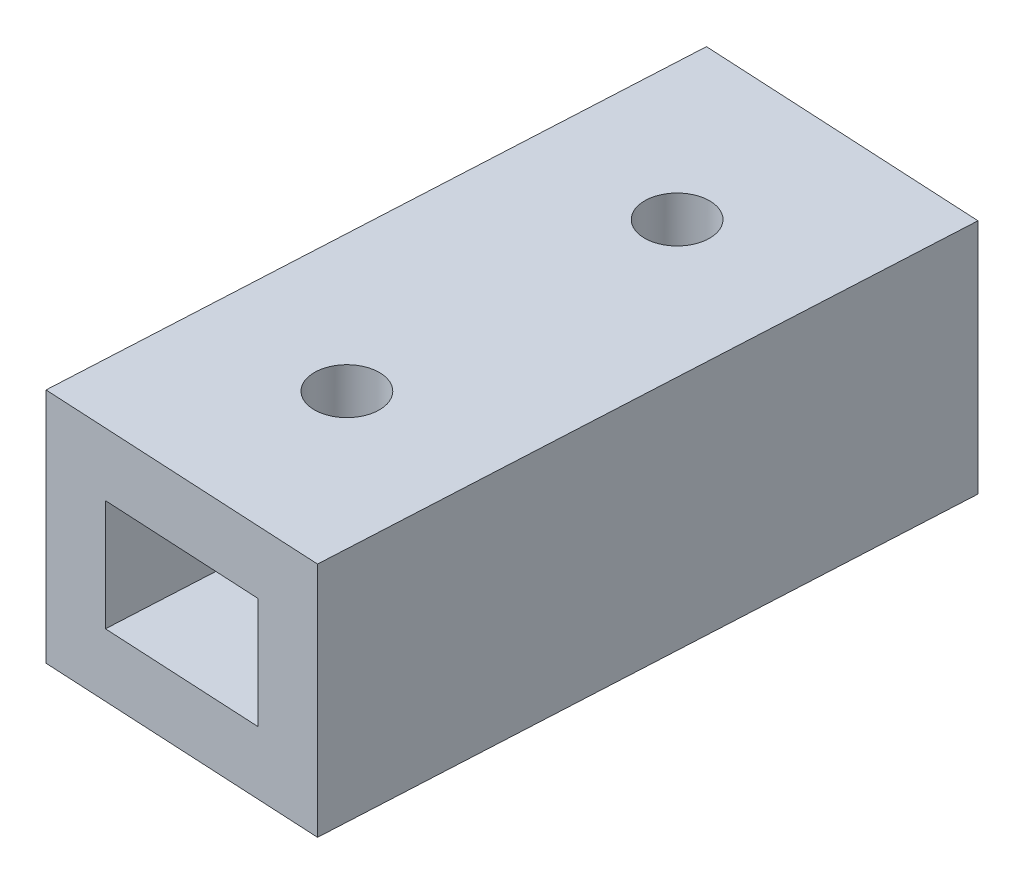
ISO-10303-21;
HEADER;
FILE_DESCRIPTION(('STEP AP214'),'2;1');
FILE_NAME('part.step','',(''),(''),'','','');
FILE_SCHEMA(('AUTOMOTIVE_DESIGN { 1 0 10303 214 1 1 1 1 }'));
ENDSEC;
DATA;
#1=APPLICATION_CONTEXT('core data for automotive mechanical design processes');
#2=APPLICATION_PROTOCOL_DEFINITION('international standard','automotive_design',2000,#1);
#3=PRODUCT_CONTEXT('',#1,'mechanical');
#4=PRODUCT('Part','Part','',(#3));
#5=PRODUCT_RELATED_PRODUCT_CATEGORY('part','',(#4));
#6=PRODUCT_DEFINITION_FORMATION('','',#4);
#7=PRODUCT_DEFINITION_CONTEXT('part definition',#1,'design');
#8=PRODUCT_DEFINITION('design','',#6,#7);
#9=PRODUCT_DEFINITION_SHAPE('','',#8);
#10=(LENGTH_UNIT() NAMED_UNIT(*) SI_UNIT(.MILLI.,.METRE.));
#11=(NAMED_UNIT(*) PLANE_ANGLE_UNIT() SI_UNIT($,.RADIAN.));
#12=(NAMED_UNIT(*) SI_UNIT($,.STERADIAN.) SOLID_ANGLE_UNIT());
#13=UNCERTAINTY_MEASURE_WITH_UNIT(LENGTH_MEASURE(1.E-05),#10,'distance_accuracy_value','');
#14=(GEOMETRIC_REPRESENTATION_CONTEXT(3) GLOBAL_UNCERTAINTY_ASSIGNED_CONTEXT((#13)) GLOBAL_UNIT_ASSIGNED_CONTEXT((#10,
#11,#12)) REPRESENTATION_CONTEXT('',''));
#15=CARTESIAN_POINT('',(0.,0.,0.));
#16=DIRECTION('',(0.,0.,1.));
#17=DIRECTION('',(1.,0.,0.));
#18=AXIS2_PLACEMENT_3D('',#15,#16,#17);
#19=CARTESIAN_POINT('',(-10.6064053641443,0.,202.091887035301));
#20=DIRECTION('',(0.052410950747902,0.,-0.998625601635418));
#21=DIRECTION('',(-0.998625601635418,0.,-0.052410950747902));
#22=AXIS2_PLACEMENT_3D('',#19,#20,#21);
#23=PLANE('',#22);
#24=DIRECTION('',(-0.998625601635418,0.,-0.052410950747902));
#25=VECTOR('',#24,1.);
#26=CARTESIAN_POINT('',(-15.353434046431,5.65,201.84274833301));
#27=LINE('',#26,#25);
#28=CARTESIAN_POINT('',(-1.67226330402577,5.65,202.560778358256));
#29=VERTEX_POINT('',#28);
#30=CARTESIAN_POINT('',(-15.353434046431,5.65,201.84274833301));
#31=VERTEX_POINT('',#30);
#32=EDGE_CURVE('E138',#29,#31,#27,.T.);
#33=ORIENTED_EDGE('',*,*,#32,.T.);
#34=DIRECTION('',(0.,-1.,0.));
#35=VECTOR('',#34,1.);
#36=CARTESIAN_POINT('',(-15.353434046431,5.65,201.84274833301));
#37=LINE('',#36,#35);
#38=CARTESIAN_POINT('',(-15.353434046431,-5.65,201.84274833301));
#39=VERTEX_POINT('',#38);
#40=EDGE_CURVE('E141',#31,#39,#37,.T.);
#41=ORIENTED_EDGE('',*,*,#40,.T.);
#42=DIRECTION('',(0.998625601635418,0.,0.052410950747902));
#43=VECTOR('',#42,1.);
#44=CARTESIAN_POINT('',(-15.353434046431,-5.65,201.84274833301));
#45=LINE('',#44,#43);
#46=CARTESIAN_POINT('',(-1.67226330402577,-5.65,202.560778358256));
#47=VERTEX_POINT('',#46);
#48=EDGE_CURVE('E144',#39,#47,#45,.T.);
#49=ORIENTED_EDGE('',*,*,#48,.T.);
#50=DIRECTION('',(0.,1.,0.));
#51=VECTOR('',#50,1.);
#52=CARTESIAN_POINT('',(-1.67226330402577,5.65,202.560778358256));
#53=LINE('',#52,#51);
#54=EDGE_CURVE('E146',#47,#29,#53,.T.);
#55=ORIENTED_EDGE('',*,*,#54,.T.);
#56=EDGE_LOOP('',(#33,#41,#49,#55));
#57=FACE_BOUND('',#56,.T.);
#58=DIRECTION('',(-0.998625601635418,0.,-0.0524109507479038));
#59=VECTOR('',#58,1.);
#60=CARTESIAN_POINT('',(-12.3575572415248,2.65,201.999981185253));
#61=LINE('',#60,#59);
#62=CARTESIAN_POINT('',(-4.66814010893203,2.65,202.403545506012));
#63=VERTEX_POINT('',#62);
#64=CARTESIAN_POINT('',(-12.3575572415248,2.65,201.999981185253));
#65=VERTEX_POINT('',#64);
#66=EDGE_CURVE('E100',#63,#65,#61,.T.);
#67=ORIENTED_EDGE('',*,*,#66,.F.);
#68=DIRECTION('',(0.,1.,0.));
#69=VECTOR('',#68,1.);
#70=CARTESIAN_POINT('',(-4.66814010893203,2.65,202.403545506012));
#71=LINE('',#70,#69);
#72=CARTESIAN_POINT('',(-4.66814010893203,-2.65,202.403545506012));
#73=VERTEX_POINT('',#72);
#74=EDGE_CURVE('E122',#73,#63,#71,.T.);
#75=ORIENTED_EDGE('',*,*,#74,.F.);
#76=DIRECTION('',(0.998625601635418,0.,0.0524109507479037));
#77=VECTOR('',#76,1.);
#78=CARTESIAN_POINT('',(-12.3575572415248,-2.65,201.999981185253));
#79=LINE('',#78,#77);
#80=CARTESIAN_POINT('',(-12.3575572415248,-2.65,201.999981185253));
#81=VERTEX_POINT('',#80);
#82=EDGE_CURVE('E120',#81,#73,#79,.T.);
#83=ORIENTED_EDGE('',*,*,#82,.F.);
#84=DIRECTION('',(0.,-1.,0.));
#85=VECTOR('',#84,1.);
#86=CARTESIAN_POINT('',(-12.3575572415248,2.65,201.999981185253));
#87=LINE('',#86,#85);
#88=EDGE_CURVE('E108',#65,#81,#87,.T.);
#89=ORIENTED_EDGE('',*,*,#88,.F.);
#90=EDGE_LOOP('',(#67,#75,#83,#89));
#91=FACE_BOUND('',#90,.T.);
#92=ADVANCED_FACE('F33',(#57,#91),#23,.F.);
#93=CARTESIAN_POINT('',(-9.03407684170723,0.,172.133118986238));
#94=DIRECTION('',(0.052410950747902,0.,-0.998625601635418));
#95=DIRECTION('',(-0.998625601635418,0.,-0.052410950747902));
#96=AXIS2_PLACEMENT_3D('',#93,#94,#95);
#97=PLANE('',#96);
#98=DIRECTION('',(-0.998625601635418,0.,-0.052410950747902));
#99=VECTOR('',#98,1.);
#100=CARTESIAN_POINT('',(-13.7811055239939,5.65,171.883980283947));
#101=LINE('',#100,#99);
#102=CARTESIAN_POINT('',(-0.0999347815886781,5.65,172.602010309193));
#103=VERTEX_POINT('',#102);
#104=CARTESIAN_POINT('',(-13.7811055239939,5.65,171.883980283947));
#105=VERTEX_POINT('',#104);
#106=EDGE_CURVE('E116',#103,#105,#101,.T.);
#107=ORIENTED_EDGE('',*,*,#106,.F.);
#108=DIRECTION('',(0.,1.,0.));
#109=VECTOR('',#108,1.);
#110=CARTESIAN_POINT('',(-0.0999347815886781,5.65,172.602010309193));
#111=LINE('',#110,#109);
#112=CARTESIAN_POINT('',(-0.0999347815886764,-5.65,172.602010309193));
#113=VERTEX_POINT('',#112);
#114=EDGE_CURVE('E142',#113,#103,#111,.T.);
#115=ORIENTED_EDGE('',*,*,#114,.F.);
#116=DIRECTION('',(0.998625601635418,0.,0.052410950747902));
#117=VECTOR('',#116,1.);
#118=CARTESIAN_POINT('',(-13.7811055239939,-5.65,171.883980283947));
#119=LINE('',#118,#117);
#120=CARTESIAN_POINT('',(-13.7811055239939,-5.65,171.883980283947));
#121=VERTEX_POINT('',#120);
#122=EDGE_CURVE('E153',#121,#113,#119,.T.);
#123=ORIENTED_EDGE('',*,*,#122,.F.);
#124=DIRECTION('',(0.,-1.,0.));
#125=VECTOR('',#124,1.);
#126=CARTESIAN_POINT('',(-13.7811055239939,5.65,171.883980283947));
#127=LINE('',#126,#125);
#128=EDGE_CURVE('E151',#105,#121,#127,.T.);
#129=ORIENTED_EDGE('',*,*,#128,.F.);
#130=EDGE_LOOP('',(#107,#115,#123,#129));
#131=FACE_BOUND('',#130,.T.);
#132=DIRECTION('',(0.,1.,0.));
#133=VECTOR('',#132,1.);
#134=CARTESIAN_POINT('',(-3.09581158649493,2.65,172.44477745695));
#135=LINE('',#134,#133);
#136=CARTESIAN_POINT('',(-3.09581158649493,-2.65,172.44477745695));
#137=VERTEX_POINT('',#136);
#138=CARTESIAN_POINT('',(-3.09581158649493,2.65,172.44477745695));
#139=VERTEX_POINT('',#138);
#140=EDGE_CURVE('E109',#137,#139,#135,.T.);
#141=ORIENTED_EDGE('',*,*,#140,.T.);
#142=DIRECTION('',(-0.998625601635418,0.,-0.0524109507479038));
#143=VECTOR('',#142,1.);
#144=CARTESIAN_POINT('',(-10.7852287190877,2.65,172.041213136191));
#145=LINE('',#144,#143);
#146=CARTESIAN_POINT('',(-10.7852287190877,2.65,172.041213136191));
#147=VERTEX_POINT('',#146);
#148=EDGE_CURVE('E58',#139,#147,#145,.T.);
#149=ORIENTED_EDGE('',*,*,#148,.T.);
#150=DIRECTION('',(0.,-1.,0.));
#151=VECTOR('',#150,1.);
#152=CARTESIAN_POINT('',(-10.7852287190877,2.65,172.041213136191));
#153=LINE('',#152,#151);
#154=CARTESIAN_POINT('',(-10.7852287190877,-2.65,172.041213136191));
#155=VERTEX_POINT('',#154);
#156=EDGE_CURVE('E115',#147,#155,#153,.T.);
#157=ORIENTED_EDGE('',*,*,#156,.T.);
#158=DIRECTION('',(0.998625601635418,0.,0.0524109507479037));
#159=VECTOR('',#158,1.);
#160=CARTESIAN_POINT('',(-10.7852287190877,-2.65,172.041213136191));
#161=LINE('',#160,#159);
#162=EDGE_CURVE('E130',#155,#137,#161,.T.);
#163=ORIENTED_EDGE('',*,*,#162,.T.);
#164=EDGE_LOOP('',(#141,#149,#157,#163));
#165=FACE_BOUND('',#164,.T.);
#166=ADVANCED_FACE('F207',(#131,#165),#97,.T.);
#167=CARTESIAN_POINT('',(-15.353434046431,5.65,201.84274833301));
#168=DIRECTION('',(0.,-1.,0.));
#169=DIRECTION('',(0.,0.,-1.));
#170=AXIS2_PLACEMENT_3D('',#167,#168,#169);
#171=PLANE('',#170);
#172=CARTESIAN_POINT('',(-7.33360228340059,5.65,179.732687308836));
#173=DIRECTION('',(0.,1.,0.));
#174=DIRECTION('',(0.,0.,1.));
#175=AXIS2_PLACEMENT_3D('',#172,#173,#174);
#176=CIRCLE('',#175,1.55);
#177=CARTESIAN_POINT('',(-7.33360228340059,5.65,181.282687308836));
#178=VERTEX_POINT('',#177);
#179=EDGE_CURVE('E165',#178,#178,#176,.T.);
#180=ORIENTED_EDGE('',*,*,#179,.F.);
#181=EDGE_LOOP('',(#180));
#182=FACE_BOUND('',#181,.T.);
#183=CARTESIAN_POINT('',(-8.11976654461914,5.65,194.712071333367));
#184=DIRECTION('',(0.,1.,0.));
#185=DIRECTION('',(0.,0.,1.));
#186=AXIS2_PLACEMENT_3D('',#183,#184,#185);
#187=CIRCLE('',#186,1.55);
#188=CARTESIAN_POINT('',(-8.11976654461914,5.65,196.262071333367));
#189=VERTEX_POINT('',#188);
#190=EDGE_CURVE('E172',#189,#189,#187,.T.);
#191=ORIENTED_EDGE('',*,*,#190,.F.);
#192=EDGE_LOOP('',(#191));
#193=FACE_BOUND('',#192,.T.);
#194=ORIENTED_EDGE('',*,*,#106,.T.);
#195=DIRECTION('',(0.0524109507479032,0.,-0.998625601635418));
#196=VECTOR('',#195,1.);
#197=CARTESIAN_POINT('',(-15.353434046431,5.65,201.84274833301));
#198=LINE('',#197,#196);
#199=EDGE_CURVE('E11',#31,#105,#198,.T.);
#200=ORIENTED_EDGE('',*,*,#199,.F.);
#201=ORIENTED_EDGE('',*,*,#32,.F.);
#202=DIRECTION('',(0.0524109507479032,0.,-0.998625601635418));
#203=VECTOR('',#202,1.);
#204=CARTESIAN_POINT('',(-1.67226330402577,5.65,202.560778358256));
#205=LINE('',#204,#203);
#206=EDGE_CURVE('E148',#29,#103,#205,.T.);
#207=ORIENTED_EDGE('',*,*,#206,.T.);
#208=EDGE_LOOP('',(#194,#200,#201,#207));
#209=FACE_BOUND('',#208,.T.);
#210=ADVANCED_FACE('F35',(#182,#193,#209),#171,.F.);
#211=CARTESIAN_POINT('',(-15.353434046431,5.65,201.84274833301));
#212=DIRECTION('',(0.998625601635418,0.,0.0524109507479032));
#213=DIRECTION('',(0.0524109507479032,0.,-0.998625601635418));
#214=AXIS2_PLACEMENT_3D('',#211,#212,#213);
#215=PLANE('',#214);
#216=ORIENTED_EDGE('',*,*,#128,.T.);
#217=DIRECTION('',(0.0524109507479032,0.,-0.998625601635418));
#218=VECTOR('',#217,1.);
#219=CARTESIAN_POINT('',(-15.353434046431,-5.65,201.84274833301));
#220=LINE('',#219,#218);
#221=EDGE_CURVE('E42',#39,#121,#220,.T.);
#222=ORIENTED_EDGE('',*,*,#221,.F.);
#223=ORIENTED_EDGE('',*,*,#40,.F.);
#224=ORIENTED_EDGE('',*,*,#199,.T.);
#225=EDGE_LOOP('',(#216,#222,#223,#224));
#226=FACE_BOUND('',#225,.T.);
#227=ADVANCED_FACE('F223',(#226),#215,.F.);
#228=CARTESIAN_POINT('',(-15.353434046431,-5.65,201.84274833301));
#229=DIRECTION('',(0.,1.,0.));
#230=DIRECTION('',(0.,0.,1.));
#231=AXIS2_PLACEMENT_3D('',#228,#229,#230);
#232=PLANE('',#231);
#233=CARTESIAN_POINT('',(-7.33360228340059,-5.65,179.732687308836));
#234=DIRECTION('',(0.,1.,0.));
#235=DIRECTION('',(0.,0.,1.));
#236=AXIS2_PLACEMENT_3D('',#233,#234,#235);
#237=CIRCLE('',#236,1.55);
#238=CARTESIAN_POINT('',(-7.33360228340059,-5.65,181.282687308836));
#239=VERTEX_POINT('',#238);
#240=EDGE_CURVE('E128',#239,#239,#237,.T.);
#241=ORIENTED_EDGE('',*,*,#240,.T.);
#242=EDGE_LOOP('',(#241));
#243=FACE_BOUND('',#242,.T.);
#244=CARTESIAN_POINT('',(-8.11976654461914,-5.65,194.712071333367));
#245=DIRECTION('',(0.,1.,0.));
#246=DIRECTION('',(0.,0.,1.));
#247=AXIS2_PLACEMENT_3D('',#244,#245,#246);
#248=CIRCLE('',#247,1.55);
#249=CARTESIAN_POINT('',(-8.11976654461914,-5.65,196.262071333367));
#250=VERTEX_POINT('',#249);
#251=EDGE_CURVE('E169',#250,#250,#248,.T.);
#252=ORIENTED_EDGE('',*,*,#251,.T.);
#253=EDGE_LOOP('',(#252));
#254=FACE_BOUND('',#253,.T.);
#255=ORIENTED_EDGE('',*,*,#122,.T.);
#256=DIRECTION('',(0.0524109507479032,0.,-0.998625601635418));
#257=VECTOR('',#256,1.);
#258=CARTESIAN_POINT('',(-1.67226330402577,-5.65,202.560778358256));
#259=LINE('',#258,#257);
#260=EDGE_CURVE('E158',#47,#113,#259,.T.);
#261=ORIENTED_EDGE('',*,*,#260,.F.);
#262=ORIENTED_EDGE('',*,*,#48,.F.);
#263=ORIENTED_EDGE('',*,*,#221,.T.);
#264=EDGE_LOOP('',(#255,#261,#262,#263));
#265=FACE_BOUND('',#264,.T.);
#266=ADVANCED_FACE('F186',(#243,#254,#265),#232,.F.);
#267=CARTESIAN_POINT('',(-1.67226330402577,5.65,202.560778358256));
#268=DIRECTION('',(-0.998625601635418,0.,-0.0524109507479032));
#269=DIRECTION('',(-0.0524109507479032,0.,0.998625601635418));
#270=AXIS2_PLACEMENT_3D('',#267,#268,#269);
#271=PLANE('',#270);
#272=ORIENTED_EDGE('',*,*,#114,.T.);
#273=ORIENTED_EDGE('',*,*,#206,.F.);
#274=ORIENTED_EDGE('',*,*,#54,.F.);
#275=ORIENTED_EDGE('',*,*,#260,.T.);
#276=EDGE_LOOP('',(#272,#273,#274,#275));
#277=FACE_BOUND('',#276,.T.);
#278=ADVANCED_FACE('F218',(#277),#271,.F.);
#279=CARTESIAN_POINT('',(-12.3575572415248,2.65,201.999981185253));
#280=DIRECTION('',(0.,-1.,0.));
#281=DIRECTION('',(0.,0.,-1.));
#282=AXIS2_PLACEMENT_3D('',#279,#280,#281);
#283=PLANE('',#282);
#284=CARTESIAN_POINT('',(-7.33360228340059,2.65,179.732687308836));
#285=DIRECTION('',(0.,-1.,0.));
#286=DIRECTION('',(0.,0.,-1.));
#287=AXIS2_PLACEMENT_3D('',#284,#285,#286);
#288=CIRCLE('',#287,1.55);
#289=CARTESIAN_POINT('',(-7.33360228340059,2.65,178.182687308836));
#290=VERTEX_POINT('',#289);
#291=EDGE_CURVE('E181',#290,#290,#288,.T.);
#292=ORIENTED_EDGE('',*,*,#291,.F.);
#293=EDGE_LOOP('',(#292));
#294=FACE_BOUND('',#293,.T.);
#295=CARTESIAN_POINT('',(-8.11976654461914,2.65,194.712071333367));
#296=DIRECTION('',(0.,-1.,0.));
#297=DIRECTION('',(0.,0.,-1.));
#298=AXIS2_PLACEMENT_3D('',#295,#296,#297);
#299=CIRCLE('',#298,1.55);
#300=CARTESIAN_POINT('',(-8.11976654461914,2.65,193.162071333367));
#301=VERTEX_POINT('',#300);
#302=EDGE_CURVE('E164',#301,#301,#299,.T.);
#303=ORIENTED_EDGE('',*,*,#302,.F.);
#304=EDGE_LOOP('',(#303));
#305=FACE_BOUND('',#304,.T.);
#306=ORIENTED_EDGE('',*,*,#148,.F.);
#307=DIRECTION('',(0.0524109507479032,0.,-0.998625601635418));
#308=VECTOR('',#307,1.);
#309=CARTESIAN_POINT('',(-4.66814010893203,2.65,202.403545506012));
#310=LINE('',#309,#308);
#311=EDGE_CURVE('E104',#63,#139,#310,.T.);
#312=ORIENTED_EDGE('',*,*,#311,.F.);
#313=ORIENTED_EDGE('',*,*,#66,.T.);
#314=DIRECTION('',(0.0524109507479032,0.,-0.998625601635418));
#315=VECTOR('',#314,1.);
#316=CARTESIAN_POINT('',(-12.3575572415248,2.65,201.999981185253));
#317=LINE('',#316,#315);
#318=EDGE_CURVE('E103',#65,#147,#317,.T.);
#319=ORIENTED_EDGE('',*,*,#318,.T.);
#320=EDGE_LOOP('',(#306,#312,#313,#319));
#321=FACE_BOUND('',#320,.T.);
#322=ADVANCED_FACE('F102',(#294,#305,#321),#283,.T.);
#323=CARTESIAN_POINT('',(-12.3575572415248,2.65,201.999981185253));
#324=DIRECTION('',(0.998625601635418,0.,0.0524109507479032));
#325=DIRECTION('',(0.0524109507479032,0.,-0.998625601635418));
#326=AXIS2_PLACEMENT_3D('',#323,#324,#325);
#327=PLANE('',#326);
#328=ORIENTED_EDGE('',*,*,#156,.F.);
#329=ORIENTED_EDGE('',*,*,#318,.F.);
#330=ORIENTED_EDGE('',*,*,#88,.T.);
#331=DIRECTION('',(0.0524109507479032,0.,-0.998625601635418));
#332=VECTOR('',#331,1.);
#333=CARTESIAN_POINT('',(-12.3575572415248,-2.65,201.999981185253));
#334=LINE('',#333,#332);
#335=EDGE_CURVE('E117',#81,#155,#334,.T.);
#336=ORIENTED_EDGE('',*,*,#335,.T.);
#337=EDGE_LOOP('',(#328,#329,#330,#336));
#338=FACE_BOUND('',#337,.T.);
#339=ADVANCED_FACE('F112',(#338),#327,.T.);
#340=CARTESIAN_POINT('',(-12.3575572415248,-2.65,201.999981185253));
#341=DIRECTION('',(0.,1.,0.));
#342=DIRECTION('',(-1.,0.,0.));
#343=AXIS2_PLACEMENT_3D('',#340,#341,#342);
#344=PLANE('',#343);
#345=CARTESIAN_POINT('',(-7.33360228340059,-2.65,179.732687308836));
#346=DIRECTION('',(0.,1.,0.));
#347=DIRECTION('',(-1.,0.,0.));
#348=AXIS2_PLACEMENT_3D('',#345,#346,#347);
#349=CIRCLE('',#348,1.55);
#350=CARTESIAN_POINT('',(-8.88360228340058,-2.65,179.732687308836));
#351=VERTEX_POINT('',#350);
#352=EDGE_CURVE('E37',#351,#351,#349,.T.);
#353=ORIENTED_EDGE('',*,*,#352,.F.);
#354=EDGE_LOOP('',(#353));
#355=FACE_BOUND('',#354,.T.);
#356=CARTESIAN_POINT('',(-8.11976654461914,-2.65,194.712071333367));
#357=DIRECTION('',(0.,1.,0.));
#358=DIRECTION('',(-1.,0.,0.));
#359=AXIS2_PLACEMENT_3D('',#356,#357,#358);
#360=CIRCLE('',#359,1.55);
#361=CARTESIAN_POINT('',(-9.66976654461914,-2.65,194.712071333367));
#362=VERTEX_POINT('',#361);
#363=EDGE_CURVE('E162',#362,#362,#360,.T.);
#364=ORIENTED_EDGE('',*,*,#363,.F.);
#365=EDGE_LOOP('',(#364));
#366=FACE_BOUND('',#365,.T.);
#367=ORIENTED_EDGE('',*,*,#162,.F.);
#368=ORIENTED_EDGE('',*,*,#335,.F.);
#369=ORIENTED_EDGE('',*,*,#82,.T.);
#370=DIRECTION('',(0.0524109507479032,0.,-0.998625601635418));
#371=VECTOR('',#370,1.);
#372=CARTESIAN_POINT('',(-4.66814010893203,-2.65,202.403545506012));
#373=LINE('',#372,#371);
#374=EDGE_CURVE('E50',#73,#137,#373,.T.);
#375=ORIENTED_EDGE('',*,*,#374,.T.);
#376=EDGE_LOOP('',(#367,#368,#369,#375));
#377=FACE_BOUND('',#376,.T.);
#378=ADVANCED_FACE('F245',(#355,#366,#377),#344,.T.);
#379=CARTESIAN_POINT('',(-4.66814010893203,2.65,202.403545506012));
#380=DIRECTION('',(-0.998625601635418,0.,-0.0524109507479032));
#381=DIRECTION('',(-0.0524109507479032,0.,0.998625601635418));
#382=AXIS2_PLACEMENT_3D('',#379,#380,#381);
#383=PLANE('',#382);
#384=ORIENTED_EDGE('',*,*,#140,.F.);
#385=ORIENTED_EDGE('',*,*,#374,.F.);
#386=ORIENTED_EDGE('',*,*,#74,.T.);
#387=ORIENTED_EDGE('',*,*,#311,.T.);
#388=EDGE_LOOP('',(#384,#385,#386,#387));
#389=FACE_BOUND('',#388,.T.);
#390=ADVANCED_FACE('F202',(#389),#383,.T.);
#391=CARTESIAN_POINT('',(-8.11976654461914,-24.35,194.712071333367));
#392=DIRECTION('',(0.,1.,0.));
#393=DIRECTION('',(0.,0.,1.));
#394=AXIS2_PLACEMENT_3D('',#391,#392,#393);
#395=CYLINDRICAL_SURFACE('',#394,1.55);
#396=ORIENTED_EDGE('',*,*,#363,.T.);
#397=EDGE_LOOP('',(#396));
#398=FACE_BOUND('',#397,.T.);
#399=ORIENTED_EDGE('',*,*,#251,.F.);
#400=EDGE_LOOP('',(#399));
#401=FACE_BOUND('',#400,.T.);
#402=ADVANCED_FACE('F192',(#398,#401),#395,.F.);
#403=CARTESIAN_POINT('',(-7.33360228340059,-24.35,179.732687308836));
#404=DIRECTION('',(0.,1.,0.));
#405=DIRECTION('',(0.,0.,1.));
#406=AXIS2_PLACEMENT_3D('',#403,#404,#405);
#407=CYLINDRICAL_SURFACE('',#406,1.55);
#408=ORIENTED_EDGE('',*,*,#352,.T.);
#409=EDGE_LOOP('',(#408));
#410=FACE_BOUND('',#409,.T.);
#411=ORIENTED_EDGE('',*,*,#240,.F.);
#412=EDGE_LOOP('',(#411));
#413=FACE_BOUND('',#412,.T.);
#414=ADVANCED_FACE('F189',(#410,#413),#407,.F.);
#415=ORIENTED_EDGE('',*,*,#302,.T.);
#416=EDGE_LOOP('',(#415));
#417=FACE_BOUND('',#416,.T.);
#418=ORIENTED_EDGE('',*,*,#190,.T.);
#419=EDGE_LOOP('',(#418));
#420=FACE_BOUND('',#419,.T.);
#421=ADVANCED_FACE('F191',(#417,#420),#395,.F.);
#422=ORIENTED_EDGE('',*,*,#291,.T.);
#423=EDGE_LOOP('',(#422));
#424=FACE_BOUND('',#423,.T.);
#425=ORIENTED_EDGE('',*,*,#179,.T.);
#426=EDGE_LOOP('',(#425));
#427=FACE_BOUND('',#426,.T.);
#428=ADVANCED_FACE('F195',(#424,#427),#407,.F.);
#429=CLOSED_SHELL('',(#92,#166,#210,#227,#266,#278,#322,#339,#378,#390,#402,#414,#421,#428));
#430=MANIFOLD_SOLID_BREP('B2',#429);
#431=ADVANCED_BREP_SHAPE_REPRESENTATION('',(#18,#430),#14);
#432=SHAPE_DEFINITION_REPRESENTATION(#9,#431);
ENDSEC;
END-ISO-10303-21;
